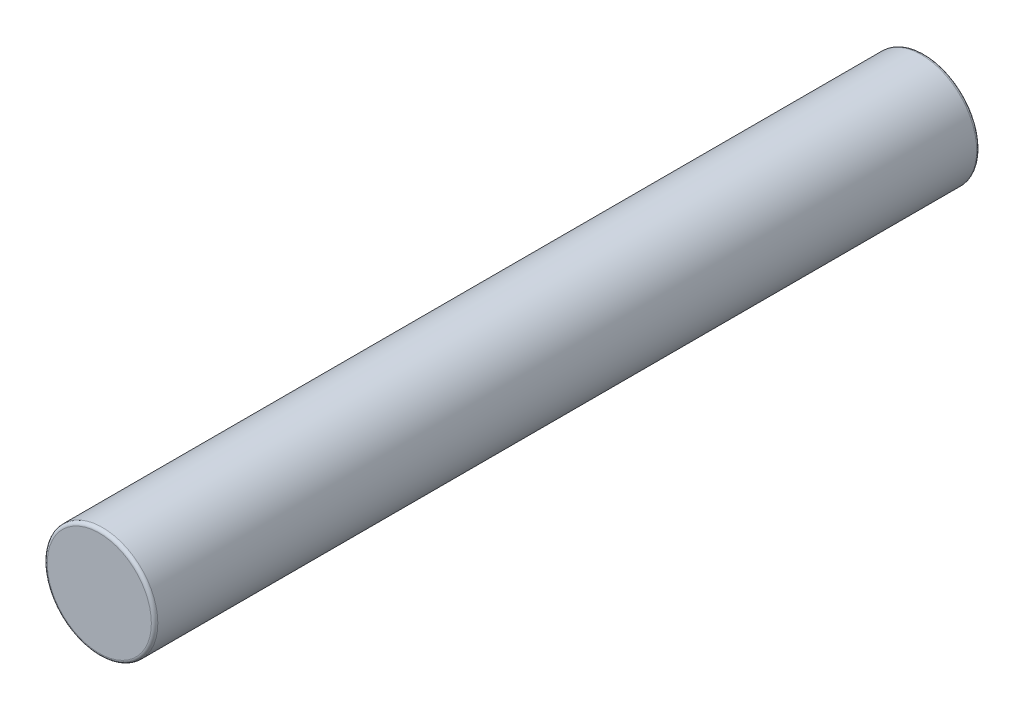
ISO-10303-21;
HEADER;
FILE_DESCRIPTION(('STEP AP214'),'2;1');
FILE_NAME('part.step','',(''),(''),'','','');
FILE_SCHEMA(('AUTOMOTIVE_DESIGN { 1 0 10303 214 1 1 1 1 }'));
ENDSEC;
DATA;
#1=APPLICATION_CONTEXT('core data for automotive mechanical design processes');
#2=APPLICATION_PROTOCOL_DEFINITION('international standard','automotive_design',2000,#1);
#3=PRODUCT_CONTEXT('',#1,'mechanical');
#4=PRODUCT('Part','Part','',(#3));
#5=PRODUCT_RELATED_PRODUCT_CATEGORY('part','',(#4));
#6=PRODUCT_DEFINITION_FORMATION('','',#4);
#7=PRODUCT_DEFINITION_CONTEXT('part definition',#1,'design');
#8=PRODUCT_DEFINITION('design','',#6,#7);
#9=PRODUCT_DEFINITION_SHAPE('','',#8);
#10=(LENGTH_UNIT() NAMED_UNIT(*) SI_UNIT(.MILLI.,.METRE.));
#11=(NAMED_UNIT(*) PLANE_ANGLE_UNIT() SI_UNIT($,.RADIAN.));
#12=(NAMED_UNIT(*) SI_UNIT($,.STERADIAN.) SOLID_ANGLE_UNIT());
#13=UNCERTAINTY_MEASURE_WITH_UNIT(LENGTH_MEASURE(1.E-05),#10,'distance_accuracy_value','');
#14=(GEOMETRIC_REPRESENTATION_CONTEXT(3) GLOBAL_UNCERTAINTY_ASSIGNED_CONTEXT((#13)) GLOBAL_UNIT_ASSIGNED_CONTEXT((#10,
#11,#12)) REPRESENTATION_CONTEXT('',''));
#15=CARTESIAN_POINT('',(0.,0.,0.));
#16=DIRECTION('',(0.,0.,1.));
#17=DIRECTION('',(1.,0.,0.));
#18=AXIS2_PLACEMENT_3D('',#15,#16,#17);
#19=CARTESIAN_POINT('',(0.,0.,127.));
#20=DIRECTION('',(0.,0.,-1.));
#21=DIRECTION('',(-1.,0.,0.));
#22=AXIS2_PLACEMENT_3D('',#19,#20,#21);
#23=CYLINDRICAL_SURFACE('',#22,8.509);
#24=CARTESIAN_POINT('',(0.,0.,0.5));
#25=DIRECTION('',(0.,0.,1.));
#26=DIRECTION('',(1.,0.,0.));
#27=AXIS2_PLACEMENT_3D('',#24,#25,#26);
#28=CIRCLE('',#27,8.509);
#29=CARTESIAN_POINT('',(8.509,0.,0.5));
#30=VERTEX_POINT('',#29);
#31=EDGE_CURVE('E45',#30,#30,#28,.T.);
#32=ORIENTED_EDGE('',*,*,#31,.T.);
#33=EDGE_LOOP('',(#32));
#34=FACE_BOUND('',#33,.T.);
#35=CARTESIAN_POINT('',(0.,0.,126.5));
#36=DIRECTION('',(0.,0.,1.));
#37=DIRECTION('',(1.,0.,0.));
#38=AXIS2_PLACEMENT_3D('',#35,#36,#37);
#39=CIRCLE('',#38,8.509);
#40=CARTESIAN_POINT('',(8.509,0.,126.5));
#41=VERTEX_POINT('',#40);
#42=EDGE_CURVE('E49',#41,#41,#39,.F.);
#43=ORIENTED_EDGE('',*,*,#42,.T.);
#44=EDGE_LOOP('',(#43));
#45=FACE_BOUND('',#44,.T.);
#46=ADVANCED_FACE('F34',(#34,#45),#23,.T.);
#47=CARTESIAN_POINT('',(0.,0.,127.));
#48=DIRECTION('',(0.,0.,1.));
#49=DIRECTION('',(1.,0.,0.));
#50=AXIS2_PLACEMENT_3D('',#47,#48,#49);
#51=PLANE('',#50);
#52=CARTESIAN_POINT('',(0.,0.,127.));
#53=DIRECTION('',(0.,0.,1.));
#54=DIRECTION('',(1.,0.,0.));
#55=AXIS2_PLACEMENT_3D('',#52,#53,#54);
#56=CIRCLE('',#55,8.009);
#57=CARTESIAN_POINT('',(8.009,0.,127.));
#58=VERTEX_POINT('',#57);
#59=EDGE_CURVE('E10',#58,#58,#56,.T.);
#60=ORIENTED_EDGE('',*,*,#59,.T.);
#61=EDGE_LOOP('',(#60));
#62=FACE_BOUND('',#61,.T.);
#63=ADVANCED_FACE('F65',(#62),#51,.T.);
#64=CARTESIAN_POINT('',(0.,0.,0.));
#65=DIRECTION('',(0.,0.,1.));
#66=DIRECTION('',(1.,0.,0.));
#67=AXIS2_PLACEMENT_3D('',#64,#65,#66);
#68=PLANE('',#67);
#69=CARTESIAN_POINT('',(0.,0.,0.));
#70=DIRECTION('',(0.,0.,1.));
#71=DIRECTION('',(1.,0.,0.));
#72=AXIS2_PLACEMENT_3D('',#69,#70,#71);
#73=CIRCLE('',#72,8.009);
#74=CARTESIAN_POINT('',(8.009,0.,0.));
#75=VERTEX_POINT('',#74);
#76=EDGE_CURVE('E41',#75,#75,#73,.F.);
#77=ORIENTED_EDGE('',*,*,#76,.T.);
#78=EDGE_LOOP('',(#77));
#79=FACE_BOUND('',#78,.T.);
#80=ADVANCED_FACE('F62',(#79),#68,.F.);
#81=CARTESIAN_POINT('',(0.,0.,0.5));
#82=DIRECTION('',(0.,0.,1.));
#83=DIRECTION('',(1.,0.,0.));
#84=AXIS2_PLACEMENT_3D('',#81,#82,#83);
#85=TOROIDAL_SURFACE('',#84,8.009,0.5);
#86=ORIENTED_EDGE('',*,*,#76,.F.);
#87=EDGE_LOOP('',(#86));
#88=FACE_BOUND('',#87,.T.);
#89=ORIENTED_EDGE('',*,*,#31,.F.);
#90=EDGE_LOOP('',(#89));
#91=FACE_BOUND('',#90,.T.);
#92=ADVANCED_FACE('F58',(#88,#91),#85,.T.);
#93=CARTESIAN_POINT('',(0.,0.,126.5));
#94=DIRECTION('',(0.,0.,1.));
#95=DIRECTION('',(1.,0.,0.));
#96=AXIS2_PLACEMENT_3D('',#93,#94,#95);
#97=TOROIDAL_SURFACE('',#96,8.009,0.5);
#98=ORIENTED_EDGE('',*,*,#42,.F.);
#99=EDGE_LOOP('',(#98));
#100=FACE_BOUND('',#99,.T.);
#101=ORIENTED_EDGE('',*,*,#59,.F.);
#102=EDGE_LOOP('',(#101));
#103=FACE_BOUND('',#102,.T.);
#104=ADVANCED_FACE('F36',(#100,#103),#97,.T.);
#105=CLOSED_SHELL('',(#46,#63,#80,#92,#104));
#106=MANIFOLD_SOLID_BREP('B2',#105);
#107=ADVANCED_BREP_SHAPE_REPRESENTATION('',(#18,#106),#14);
#108=SHAPE_DEFINITION_REPRESENTATION(#9,#107);
ENDSEC;
END-ISO-10303-21;
